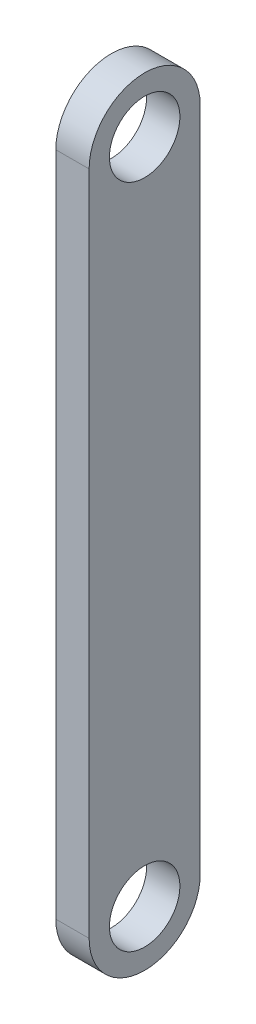
ISO-10303-21;
HEADER;
FILE_DESCRIPTION(('STEP AP214'),'2;1');
FILE_NAME('part.step','',(''),(''),'','','');
FILE_SCHEMA(('AUTOMOTIVE_DESIGN { 1 0 10303 214 1 1 1 1 }'));
ENDSEC;
DATA;
#1=APPLICATION_CONTEXT('core data for automotive mechanical design processes');
#2=APPLICATION_PROTOCOL_DEFINITION('international standard','automotive_design',2000,#1);
#3=PRODUCT_CONTEXT('',#1,'mechanical');
#4=PRODUCT('Part','Part','',(#3));
#5=PRODUCT_RELATED_PRODUCT_CATEGORY('part','',(#4));
#6=PRODUCT_DEFINITION_FORMATION('','',#4);
#7=PRODUCT_DEFINITION_CONTEXT('part definition',#1,'design');
#8=PRODUCT_DEFINITION('design','',#6,#7);
#9=PRODUCT_DEFINITION_SHAPE('','',#8);
#10=(LENGTH_UNIT() NAMED_UNIT(*) SI_UNIT(.MILLI.,.METRE.));
#11=(NAMED_UNIT(*) PLANE_ANGLE_UNIT() SI_UNIT($,.RADIAN.));
#12=(NAMED_UNIT(*) SI_UNIT($,.STERADIAN.) SOLID_ANGLE_UNIT());
#13=UNCERTAINTY_MEASURE_WITH_UNIT(LENGTH_MEASURE(1.E-05),#10,'distance_accuracy_value','');
#14=(GEOMETRIC_REPRESENTATION_CONTEXT(3) GLOBAL_UNCERTAINTY_ASSIGNED_CONTEXT((#13)) GLOBAL_UNIT_ASSIGNED_CONTEXT((#10,
#11,#12)) REPRESENTATION_CONTEXT('',''));
#15=CARTESIAN_POINT('',(0.,0.,0.));
#16=DIRECTION('',(0.,0.,1.));
#17=DIRECTION('',(1.,0.,0.));
#18=AXIS2_PLACEMENT_3D('',#15,#16,#17);
#19=CARTESIAN_POINT('',(3.,-30.,0.));
#20=DIRECTION('',(-1.,0.,0.));
#21=DIRECTION('',(0.,0.,1.));
#22=AXIS2_PLACEMENT_3D('',#19,#20,#21);
#23=CYLINDRICAL_SURFACE('',#22,5.);
#24=DIRECTION('',(-1.,0.,0.));
#25=VECTOR('',#24,1.);
#26=CARTESIAN_POINT('',(3.,-30.,-5.));
#27=LINE('',#26,#25);
#28=CARTESIAN_POINT('',(3.,-30.,-5.));
#29=VERTEX_POINT('',#28);
#30=CARTESIAN_POINT('',(0.,-30.,-5.));
#31=VERTEX_POINT('',#30);
#32=EDGE_CURVE('E93',#29,#31,#27,.T.);
#33=ORIENTED_EDGE('',*,*,#32,.F.);
#34=CARTESIAN_POINT('',(3.,-30.,0.));
#35=DIRECTION('',(-1.,0.,0.));
#36=DIRECTION('',(0.,0.,1.));
#37=AXIS2_PLACEMENT_3D('',#34,#35,#36);
#38=CIRCLE('',#37,5.);
#39=CARTESIAN_POINT('',(3.,-30.,5.));
#40=VERTEX_POINT('',#39);
#41=EDGE_CURVE('E47',#40,#29,#38,.F.);
#42=ORIENTED_EDGE('',*,*,#41,.F.);
#43=DIRECTION('',(1.,0.,0.));
#44=VECTOR('',#43,1.);
#45=CARTESIAN_POINT('',(3.,-30.,5.));
#46=LINE('',#45,#44);
#47=CARTESIAN_POINT('',(0.,-30.,5.));
#48=VERTEX_POINT('',#47);
#49=EDGE_CURVE('E110',#48,#40,#46,.T.);
#50=ORIENTED_EDGE('',*,*,#49,.F.);
#51=CARTESIAN_POINT('',(0.,-30.,0.));
#52=DIRECTION('',(-1.,0.,0.));
#53=DIRECTION('',(0.,0.,1.));
#54=AXIS2_PLACEMENT_3D('',#51,#52,#53);
#55=CIRCLE('',#54,5.);
#56=EDGE_CURVE('E11',#31,#48,#55,.T.);
#57=ORIENTED_EDGE('',*,*,#56,.F.);
#58=EDGE_LOOP('',(#33,#42,#50,#57));
#59=FACE_BOUND('',#58,.T.);
#60=ADVANCED_FACE('F39',(#59),#23,.T.);
#61=CARTESIAN_POINT('',(3.,30.,0.));
#62=DIRECTION('',(-1.,0.,0.));
#63=DIRECTION('',(0.,0.,1.));
#64=AXIS2_PLACEMENT_3D('',#61,#62,#63);
#65=CYLINDRICAL_SURFACE('',#64,5.);
#66=DIRECTION('',(-1.,0.,0.));
#67=VECTOR('',#66,1.);
#68=CARTESIAN_POINT('',(3.,30.,5.));
#69=LINE('',#68,#67);
#70=CARTESIAN_POINT('',(3.,30.,5.));
#71=VERTEX_POINT('',#70);
#72=CARTESIAN_POINT('',(0.,30.,5.));
#73=VERTEX_POINT('',#72);
#74=EDGE_CURVE('E90',#71,#73,#69,.T.);
#75=ORIENTED_EDGE('',*,*,#74,.F.);
#76=CARTESIAN_POINT('',(3.,30.,0.));
#77=DIRECTION('',(-1.,0.,0.));
#78=DIRECTION('',(0.,0.,1.));
#79=AXIS2_PLACEMENT_3D('',#76,#77,#78);
#80=CIRCLE('',#79,5.);
#81=CARTESIAN_POINT('',(3.,30.,-5.));
#82=VERTEX_POINT('',#81);
#83=EDGE_CURVE('E94',#82,#71,#80,.F.);
#84=ORIENTED_EDGE('',*,*,#83,.F.);
#85=DIRECTION('',(1.,0.,0.));
#86=VECTOR('',#85,1.);
#87=CARTESIAN_POINT('',(3.,30.,-5.));
#88=LINE('',#87,#86);
#89=CARTESIAN_POINT('',(0.,30.,-5.));
#90=VERTEX_POINT('',#89);
#91=EDGE_CURVE('E92',#90,#82,#88,.T.);
#92=ORIENTED_EDGE('',*,*,#91,.F.);
#93=CARTESIAN_POINT('',(0.,30.,0.));
#94=DIRECTION('',(-1.,0.,0.));
#95=DIRECTION('',(0.,0.,1.));
#96=AXIS2_PLACEMENT_3D('',#93,#94,#95);
#97=CIRCLE('',#96,5.);
#98=EDGE_CURVE('E79',#73,#90,#97,.T.);
#99=ORIENTED_EDGE('',*,*,#98,.F.);
#100=EDGE_LOOP('',(#75,#84,#92,#99));
#101=FACE_BOUND('',#100,.T.);
#102=ADVANCED_FACE('F88',(#101),#65,.T.);
#103=CARTESIAN_POINT('',(3.,-35.,5.));
#104=DIRECTION('',(0.,0.,1.));
#105=DIRECTION('',(1.,0.,0.));
#106=AXIS2_PLACEMENT_3D('',#103,#104,#105);
#107=PLANE('',#106);
#108=DIRECTION('',(0.,1.,0.));
#109=VECTOR('',#108,1.);
#110=CARTESIAN_POINT('',(0.,-35.,5.));
#111=LINE('',#110,#109);
#112=EDGE_CURVE('E76',#48,#73,#111,.T.);
#113=ORIENTED_EDGE('',*,*,#112,.F.);
#114=ORIENTED_EDGE('',*,*,#49,.T.);
#115=DIRECTION('',(0.,1.,0.));
#116=VECTOR('',#115,1.);
#117=CARTESIAN_POINT('',(3.,-35.,5.));
#118=LINE('',#117,#116);
#119=EDGE_CURVE('E98',#40,#71,#118,.T.);
#120=ORIENTED_EDGE('',*,*,#119,.T.);
#121=ORIENTED_EDGE('',*,*,#74,.T.);
#122=EDGE_LOOP('',(#113,#114,#120,#121));
#123=FACE_BOUND('',#122,.T.);
#124=ADVANCED_FACE('F96',(#123),#107,.T.);
#125=CARTESIAN_POINT('',(3.,-35.,-5.));
#126=DIRECTION('',(0.,0.,1.));
#127=DIRECTION('',(1.,0.,0.));
#128=AXIS2_PLACEMENT_3D('',#125,#126,#127);
#129=PLANE('',#128);
#130=DIRECTION('',(0.,1.,0.));
#131=VECTOR('',#130,1.);
#132=CARTESIAN_POINT('',(3.,-35.,-5.));
#133=LINE('',#132,#131);
#134=EDGE_CURVE('E100',#29,#82,#133,.T.);
#135=ORIENTED_EDGE('',*,*,#134,.F.);
#136=ORIENTED_EDGE('',*,*,#32,.T.);
#137=DIRECTION('',(0.,1.,0.));
#138=VECTOR('',#137,1.);
#139=CARTESIAN_POINT('',(0.,-35.,-5.));
#140=LINE('',#139,#138);
#141=EDGE_CURVE('E83',#31,#90,#140,.T.);
#142=ORIENTED_EDGE('',*,*,#141,.T.);
#143=ORIENTED_EDGE('',*,*,#91,.T.);
#144=EDGE_LOOP('',(#135,#136,#142,#143));
#145=FACE_BOUND('',#144,.T.);
#146=ADVANCED_FACE('F115',(#145),#129,.F.);
#147=CARTESIAN_POINT('',(3.,0.,0.));
#148=DIRECTION('',(-1.,0.,0.));
#149=DIRECTION('',(0.,0.,1.));
#150=AXIS2_PLACEMENT_3D('',#147,#148,#149);
#151=PLANE('',#150);
#152=CARTESIAN_POINT('',(3.,30.,0.));
#153=DIRECTION('',(1.,0.,0.));
#154=DIRECTION('',(0.,0.,-1.));
#155=AXIS2_PLACEMENT_3D('',#152,#153,#154);
#156=CIRCLE('',#155,3.175);
#157=CARTESIAN_POINT('',(3.,30.,-3.175));
#158=VERTEX_POINT('',#157);
#159=EDGE_CURVE('E120',#158,#158,#156,.T.);
#160=ORIENTED_EDGE('',*,*,#159,.F.);
#161=EDGE_LOOP('',(#160));
#162=FACE_BOUND('',#161,.T.);
#163=CARTESIAN_POINT('',(3.,-30.,0.));
#164=DIRECTION('',(1.,0.,0.));
#165=DIRECTION('',(0.,0.,-1.));
#166=AXIS2_PLACEMENT_3D('',#163,#164,#165);
#167=CIRCLE('',#166,3.175);
#168=CARTESIAN_POINT('',(3.,-30.,-3.175));
#169=VERTEX_POINT('',#168);
#170=EDGE_CURVE('E125',#169,#169,#167,.T.);
#171=ORIENTED_EDGE('',*,*,#170,.F.);
#172=EDGE_LOOP('',(#171));
#173=FACE_BOUND('',#172,.T.);
#174=ORIENTED_EDGE('',*,*,#119,.F.);
#175=ORIENTED_EDGE('',*,*,#41,.T.);
#176=ORIENTED_EDGE('',*,*,#134,.T.);
#177=ORIENTED_EDGE('',*,*,#83,.T.);
#178=EDGE_LOOP('',(#174,#175,#176,#177));
#179=FACE_BOUND('',#178,.T.);
#180=ADVANCED_FACE('F112',(#162,#173,#179),#151,.F.);
#181=CARTESIAN_POINT('',(0.,0.,0.));
#182=DIRECTION('',(-1.,0.,0.));
#183=DIRECTION('',(0.,0.,1.));
#184=AXIS2_PLACEMENT_3D('',#181,#182,#183);
#185=PLANE('',#184);
#186=CARTESIAN_POINT('',(0.,30.,0.));
#187=DIRECTION('',(-1.,0.,0.));
#188=DIRECTION('',(0.,0.,1.));
#189=AXIS2_PLACEMENT_3D('',#186,#187,#188);
#190=CIRCLE('',#189,3.175);
#191=CARTESIAN_POINT('',(0.,30.,3.175));
#192=VERTEX_POINT('',#191);
#193=EDGE_CURVE('E84',#192,#192,#190,.T.);
#194=ORIENTED_EDGE('',*,*,#193,.F.);
#195=EDGE_LOOP('',(#194));
#196=FACE_BOUND('',#195,.T.);
#197=CARTESIAN_POINT('',(0.,-30.,0.));
#198=DIRECTION('',(-1.,0.,0.));
#199=DIRECTION('',(0.,0.,1.));
#200=AXIS2_PLACEMENT_3D('',#197,#198,#199);
#201=CIRCLE('',#200,3.175);
#202=CARTESIAN_POINT('',(0.,-30.,3.175));
#203=VERTEX_POINT('',#202);
#204=EDGE_CURVE('E118',#203,#203,#201,.T.);
#205=ORIENTED_EDGE('',*,*,#204,.F.);
#206=EDGE_LOOP('',(#205));
#207=FACE_BOUND('',#206,.T.);
#208=ORIENTED_EDGE('',*,*,#141,.F.);
#209=ORIENTED_EDGE('',*,*,#56,.T.);
#210=ORIENTED_EDGE('',*,*,#112,.T.);
#211=ORIENTED_EDGE('',*,*,#98,.T.);
#212=EDGE_LOOP('',(#208,#209,#210,#211));
#213=FACE_BOUND('',#212,.T.);
#214=ADVANCED_FACE('F78',(#196,#207,#213),#185,.T.);
#215=CARTESIAN_POINT('',(-2.,-30.,0.));
#216=DIRECTION('',(1.,0.,0.));
#217=DIRECTION('',(0.,0.,-1.));
#218=AXIS2_PLACEMENT_3D('',#215,#216,#217);
#219=CYLINDRICAL_SURFACE('',#218,3.175);
#220=ORIENTED_EDGE('',*,*,#204,.T.);
#221=EDGE_LOOP('',(#220));
#222=FACE_BOUND('',#221,.T.);
#223=ORIENTED_EDGE('',*,*,#170,.T.);
#224=EDGE_LOOP('',(#223));
#225=FACE_BOUND('',#224,.T.);
#226=ADVANCED_FACE('F133',(#222,#225),#219,.F.);
#227=CARTESIAN_POINT('',(-2.,30.,0.));
#228=DIRECTION('',(1.,0.,0.));
#229=DIRECTION('',(0.,0.,-1.));
#230=AXIS2_PLACEMENT_3D('',#227,#228,#229);
#231=CYLINDRICAL_SURFACE('',#230,3.175);
#232=ORIENTED_EDGE('',*,*,#193,.T.);
#233=EDGE_LOOP('',(#232));
#234=FACE_BOUND('',#233,.T.);
#235=ORIENTED_EDGE('',*,*,#159,.T.);
#236=EDGE_LOOP('',(#235));
#237=FACE_BOUND('',#236,.T.);
#238=ADVANCED_FACE('F184',(#234,#237),#231,.F.);
#239=CLOSED_SHELL('',(#60,#102,#124,#146,#180,#214,#226,#238));
#240=MANIFOLD_SOLID_BREP('B2',#239);
#241=ADVANCED_BREP_SHAPE_REPRESENTATION('',(#18,#240),#14);
#242=SHAPE_DEFINITION_REPRESENTATION(#9,#241);
ENDSEC;
END-ISO-10303-21;
